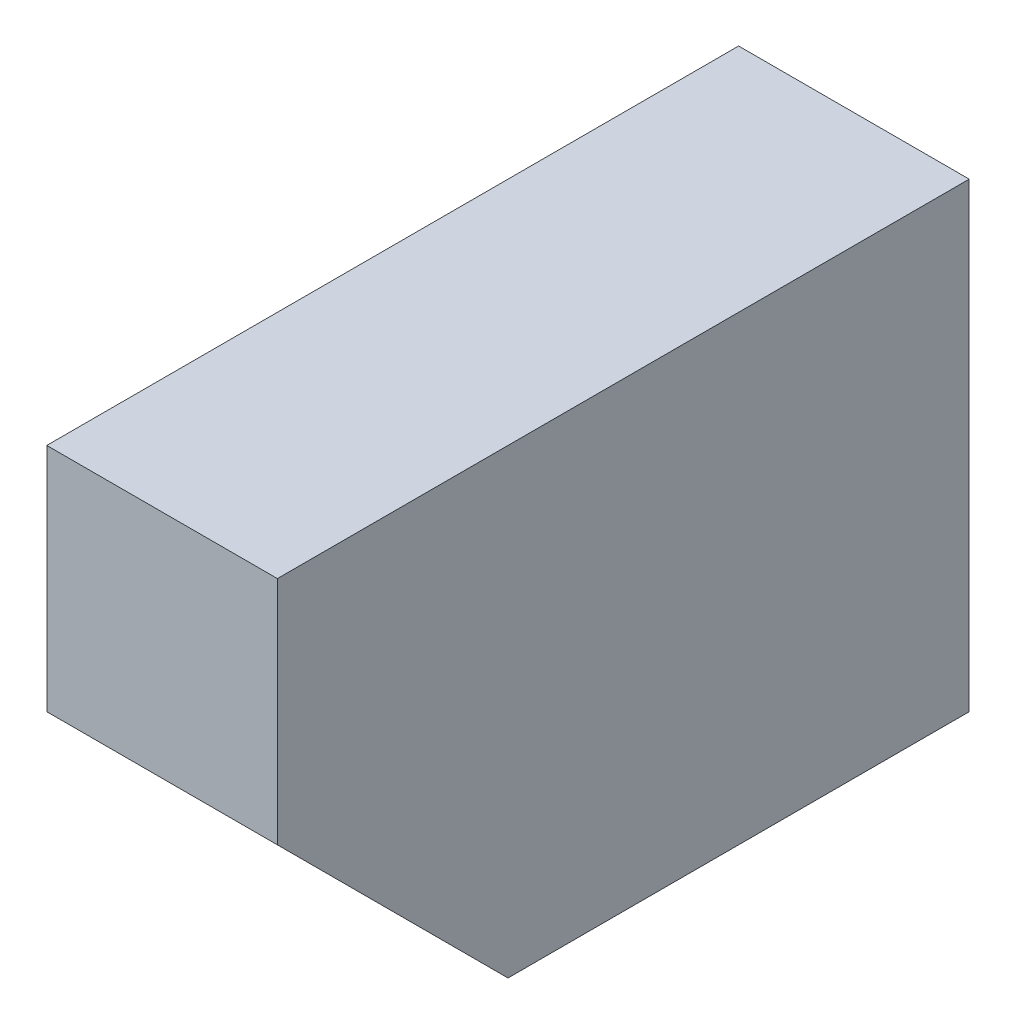
ISO-10303-21;
HEADER;
FILE_DESCRIPTION(('STEP AP214'),'2;1');
FILE_NAME('part.step','',(''),(''),'','','');
FILE_SCHEMA(('AUTOMOTIVE_DESIGN { 1 0 10303 214 1 1 1 1 }'));
ENDSEC;
DATA;
#1=APPLICATION_CONTEXT('core data for automotive mechanical design processes');
#2=APPLICATION_PROTOCOL_DEFINITION('international standard','automotive_design',2000,#1);
#3=PRODUCT_CONTEXT('',#1,'mechanical');
#4=PRODUCT('Part','Part','',(#3));
#5=PRODUCT_RELATED_PRODUCT_CATEGORY('part','',(#4));
#6=PRODUCT_DEFINITION_FORMATION('','',#4);
#7=PRODUCT_DEFINITION_CONTEXT('part definition',#1,'design');
#8=PRODUCT_DEFINITION('design','',#6,#7);
#9=PRODUCT_DEFINITION_SHAPE('','',#8);
#10=(LENGTH_UNIT() NAMED_UNIT(*) SI_UNIT(.MILLI.,.METRE.));
#11=(NAMED_UNIT(*) PLANE_ANGLE_UNIT() SI_UNIT($,.RADIAN.));
#12=(NAMED_UNIT(*) SI_UNIT($,.STERADIAN.) SOLID_ANGLE_UNIT());
#13=UNCERTAINTY_MEASURE_WITH_UNIT(LENGTH_MEASURE(1.E-05),#10,'distance_accuracy_value','');
#14=(GEOMETRIC_REPRESENTATION_CONTEXT(3) GLOBAL_UNCERTAINTY_ASSIGNED_CONTEXT((#13)) GLOBAL_UNIT_ASSIGNED_CONTEXT((#10,
#11,#12)) REPRESENTATION_CONTEXT('',''));
#15=CARTESIAN_POINT('',(0.,0.,0.));
#16=DIRECTION('',(0.,0.,1.));
#17=DIRECTION('',(1.,0.,0.));
#18=AXIS2_PLACEMENT_3D('',#15,#16,#17);
#19=CARTESIAN_POINT('',(-25.,50.,150.));
#20=DIRECTION('',(1.,0.,0.));
#21=DIRECTION('',(0.,1.,0.));
#22=AXIS2_PLACEMENT_3D('',#19,#20,#21);
#23=PLANE('',#22);
#24=DIRECTION('',(0.,0.,-1.));
#25=VECTOR('',#24,1.);
#26=CARTESIAN_POINT('',(-25.,-50.,150.));
#27=LINE('',#26,#25);
#28=CARTESIAN_POINT('',(-25.,-50.,99.9999999999998));
#29=VERTEX_POINT('',#28);
#30=CARTESIAN_POINT('',(-25.,-50.,0.));
#31=VERTEX_POINT('',#30);
#32=EDGE_CURVE('E45',#29,#31,#27,.T.);
#33=ORIENTED_EDGE('',*,*,#32,.F.);
#34=DIRECTION('',(0.,-0.707106781186546,-0.707106781186548));
#35=VECTOR('',#34,1.);
#36=CARTESIAN_POINT('',(-25.,0.,150.));
#37=LINE('',#36,#35);
#38=CARTESIAN_POINT('',(-25.,0.,150.));
#39=VERTEX_POINT('',#38);
#40=EDGE_CURVE('E119',#39,#29,#37,.T.);
#41=ORIENTED_EDGE('',*,*,#40,.F.);
#42=DIRECTION('',(0.,-1.,0.));
#43=VECTOR('',#42,1.);
#44=CARTESIAN_POINT('',(-25.,50.,150.));
#45=LINE('',#44,#43);
#46=CARTESIAN_POINT('',(-25.,50.,150.));
#47=VERTEX_POINT('',#46);
#48=EDGE_CURVE('E89',#47,#39,#45,.T.);
#49=ORIENTED_EDGE('',*,*,#48,.F.);
#50=DIRECTION('',(0.,0.,-1.));
#51=VECTOR('',#50,1.);
#52=CARTESIAN_POINT('',(-25.,50.,150.));
#53=LINE('',#52,#51);
#54=CARTESIAN_POINT('',(-25.,50.,0.));
#55=VERTEX_POINT('',#54);
#56=EDGE_CURVE('E82',#47,#55,#53,.T.);
#57=ORIENTED_EDGE('',*,*,#56,.T.);
#58=DIRECTION('',(0.,-1.,0.));
#59=VECTOR('',#58,1.);
#60=CARTESIAN_POINT('',(-25.,50.,0.));
#61=LINE('',#60,#59);
#62=EDGE_CURVE('E95',#55,#31,#61,.T.);
#63=ORIENTED_EDGE('',*,*,#62,.T.);
#64=EDGE_LOOP('',(#33,#41,#49,#57,#63));
#65=FACE_BOUND('',#64,.T.);
#66=ADVANCED_FACE('F38',(#65),#23,.F.);
#67=CARTESIAN_POINT('',(-25.,-50.,150.));
#68=DIRECTION('',(0.,1.,0.));
#69=DIRECTION('',(0.,0.,1.));
#70=AXIS2_PLACEMENT_3D('',#67,#68,#69);
#71=PLANE('',#70);
#72=DIRECTION('',(0.,0.,-1.));
#73=VECTOR('',#72,1.);
#74=CARTESIAN_POINT('',(25.,-50.,150.));
#75=LINE('',#74,#73);
#76=CARTESIAN_POINT('',(25.,-50.,99.9999999999998));
#77=VERTEX_POINT('',#76);
#78=CARTESIAN_POINT('',(25.,-50.,0.));
#79=VERTEX_POINT('',#78);
#80=EDGE_CURVE('E111',#77,#79,#75,.T.);
#81=ORIENTED_EDGE('',*,*,#80,.F.);
#82=DIRECTION('',(-1.,0.,0.));
#83=VECTOR('',#82,1.);
#84=CARTESIAN_POINT('',(125.,-50.,99.9999999999998));
#85=LINE('',#84,#83);
#86=EDGE_CURVE('E104',#77,#29,#85,.T.);
#87=ORIENTED_EDGE('',*,*,#86,.T.);
#88=ORIENTED_EDGE('',*,*,#32,.T.);
#89=DIRECTION('',(1.,0.,0.));
#90=VECTOR('',#89,1.);
#91=CARTESIAN_POINT('',(-25.,-50.,0.));
#92=LINE('',#91,#90);
#93=EDGE_CURVE('E101',#31,#79,#92,.T.);
#94=ORIENTED_EDGE('',*,*,#93,.T.);
#95=EDGE_LOOP('',(#81,#87,#88,#94));
#96=FACE_BOUND('',#95,.T.);
#97=ADVANCED_FACE('F115',(#96),#71,.F.);
#98=CARTESIAN_POINT('',(25.,50.,150.));
#99=DIRECTION('',(-1.,0.,0.));
#100=DIRECTION('',(0.,-1.,0.));
#101=AXIS2_PLACEMENT_3D('',#98,#99,#100);
#102=PLANE('',#101);
#103=DIRECTION('',(0.,1.,0.));
#104=VECTOR('',#103,1.);
#105=CARTESIAN_POINT('',(25.,50.,150.));
#106=LINE('',#105,#104);
#107=CARTESIAN_POINT('',(25.,0.,150.));
#108=VERTEX_POINT('',#107);
#109=CARTESIAN_POINT('',(25.,50.,150.));
#110=VERTEX_POINT('',#109);
#111=EDGE_CURVE('E125',#108,#110,#106,.T.);
#112=ORIENTED_EDGE('',*,*,#111,.F.);
#113=DIRECTION('',(0.,-0.707106781186546,-0.707106781186549));
#114=VECTOR('',#113,1.);
#115=CARTESIAN_POINT('',(25.,24.9999999999999,175.));
#116=LINE('',#115,#114);
#117=EDGE_CURVE('E51',#108,#77,#116,.T.);
#118=ORIENTED_EDGE('',*,*,#117,.T.);
#119=ORIENTED_EDGE('',*,*,#80,.T.);
#120=DIRECTION('',(0.,1.,0.));
#121=VECTOR('',#120,1.);
#122=CARTESIAN_POINT('',(25.,50.,0.));
#123=LINE('',#122,#121);
#124=CARTESIAN_POINT('',(25.,50.,0.));
#125=VERTEX_POINT('',#124);
#126=EDGE_CURVE('E90',#79,#125,#123,.T.);
#127=ORIENTED_EDGE('',*,*,#126,.T.);
#128=DIRECTION('',(0.,0.,-1.));
#129=VECTOR('',#128,1.);
#130=CARTESIAN_POINT('',(25.,50.,150.));
#131=LINE('',#130,#129);
#132=EDGE_CURVE('E85',#110,#125,#131,.T.);
#133=ORIENTED_EDGE('',*,*,#132,.F.);
#134=EDGE_LOOP('',(#112,#118,#119,#127,#133));
#135=FACE_BOUND('',#134,.T.);
#136=ADVANCED_FACE('F127',(#135),#102,.F.);
#137=CARTESIAN_POINT('',(-25.,50.,150.));
#138=DIRECTION('',(0.,-1.,0.));
#139=DIRECTION('',(0.,0.,-1.));
#140=AXIS2_PLACEMENT_3D('',#137,#138,#139);
#141=PLANE('',#140);
#142=DIRECTION('',(-1.,0.,0.));
#143=VECTOR('',#142,1.);
#144=CARTESIAN_POINT('',(-25.,50.,0.));
#145=LINE('',#144,#143);
#146=EDGE_CURVE('E79',#125,#55,#145,.T.);
#147=ORIENTED_EDGE('',*,*,#146,.T.);
#148=ORIENTED_EDGE('',*,*,#56,.F.);
#149=DIRECTION('',(-1.,0.,0.));
#150=VECTOR('',#149,1.);
#151=CARTESIAN_POINT('',(-25.,50.,150.));
#152=LINE('',#151,#150);
#153=EDGE_CURVE('E60',#110,#47,#152,.T.);
#154=ORIENTED_EDGE('',*,*,#153,.F.);
#155=ORIENTED_EDGE('',*,*,#132,.T.);
#156=EDGE_LOOP('',(#147,#148,#154,#155));
#157=FACE_BOUND('',#156,.T.);
#158=ADVANCED_FACE('F81',(#157),#141,.F.);
#159=CARTESIAN_POINT('',(0.,0.,150.));
#160=DIRECTION('',(0.,0.,1.));
#161=DIRECTION('',(1.,0.,0.));
#162=AXIS2_PLACEMENT_3D('',#159,#160,#161);
#163=PLANE('',#162);
#164=DIRECTION('',(-1.,0.,0.));
#165=VECTOR('',#164,1.);
#166=CARTESIAN_POINT('',(0.,0.,150.));
#167=LINE('',#166,#165);
#168=EDGE_CURVE('E11',#108,#39,#167,.T.);
#169=ORIENTED_EDGE('',*,*,#168,.F.);
#170=ORIENTED_EDGE('',*,*,#111,.T.);
#171=ORIENTED_EDGE('',*,*,#153,.T.);
#172=ORIENTED_EDGE('',*,*,#48,.T.);
#173=EDGE_LOOP('',(#169,#170,#171,#172));
#174=FACE_BOUND('',#173,.T.);
#175=ADVANCED_FACE('F124',(#174),#163,.T.);
#176=CARTESIAN_POINT('',(0.,0.,0.));
#177=DIRECTION('',(0.,0.,1.));
#178=DIRECTION('',(1.,0.,0.));
#179=AXIS2_PLACEMENT_3D('',#176,#177,#178);
#180=PLANE('',#179);
#181=ORIENTED_EDGE('',*,*,#62,.F.);
#182=ORIENTED_EDGE('',*,*,#146,.F.);
#183=ORIENTED_EDGE('',*,*,#126,.F.);
#184=ORIENTED_EDGE('',*,*,#93,.F.);
#185=EDGE_LOOP('',(#181,#182,#183,#184));
#186=FACE_BOUND('',#185,.T.);
#187=ADVANCED_FACE('F99',(#186),#180,.F.);
#188=CARTESIAN_POINT('',(125.,0.,150.));
#189=DIRECTION('',(0.,0.707106781186549,-0.707106781186546));
#190=DIRECTION('',(0.,0.707106781186546,0.707106781186549));
#191=AXIS2_PLACEMENT_3D('',#188,#189,#190);
#192=PLANE('',#191);
#193=ORIENTED_EDGE('',*,*,#168,.T.);
#194=ORIENTED_EDGE('',*,*,#40,.T.);
#195=ORIENTED_EDGE('',*,*,#86,.F.);
#196=ORIENTED_EDGE('',*,*,#117,.F.);
#197=EDGE_LOOP('',(#193,#194,#195,#196));
#198=FACE_BOUND('',#197,.T.);
#199=ADVANCED_FACE('F122',(#198),#192,.F.);
#200=CLOSED_SHELL('',(#66,#97,#136,#158,#175,#187,#199));
#201=MANIFOLD_SOLID_BREP('B2',#200);
#202=ADVANCED_BREP_SHAPE_REPRESENTATION('',(#18,#201),#14);
#203=SHAPE_DEFINITION_REPRESENTATION(#9,#202);
ENDSEC;
END-ISO-10303-21;
